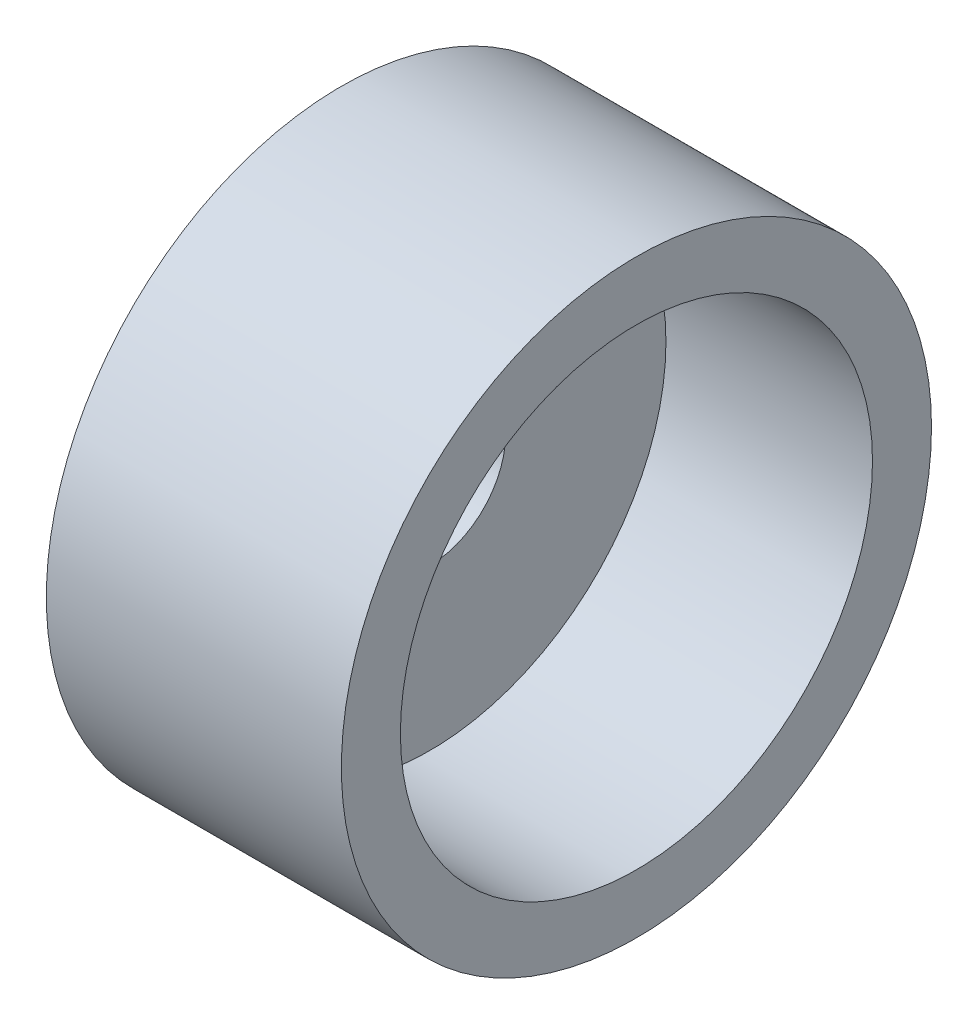
ISO-10303-21;
HEADER;
FILE_DESCRIPTION(('STEP AP214'),'2;1');
FILE_NAME('part.step','',(''),(''),'','','');
FILE_SCHEMA(('AUTOMOTIVE_DESIGN { 1 0 10303 214 1 1 1 1 }'));
ENDSEC;
DATA;
#1=APPLICATION_CONTEXT('core data for automotive mechanical design processes');
#2=APPLICATION_PROTOCOL_DEFINITION('international standard','automotive_design',2000,#1);
#3=PRODUCT_CONTEXT('',#1,'mechanical');
#4=PRODUCT('Part','Part','',(#3));
#5=PRODUCT_RELATED_PRODUCT_CATEGORY('part','',(#4));
#6=PRODUCT_DEFINITION_FORMATION('','',#4);
#7=PRODUCT_DEFINITION_CONTEXT('part definition',#1,'design');
#8=PRODUCT_DEFINITION('design','',#6,#7);
#9=PRODUCT_DEFINITION_SHAPE('','',#8);
#10=(LENGTH_UNIT() NAMED_UNIT(*) SI_UNIT(.MILLI.,.METRE.));
#11=(NAMED_UNIT(*) PLANE_ANGLE_UNIT() SI_UNIT($,.RADIAN.));
#12=(NAMED_UNIT(*) SI_UNIT($,.STERADIAN.) SOLID_ANGLE_UNIT());
#13=UNCERTAINTY_MEASURE_WITH_UNIT(LENGTH_MEASURE(1.E-05),#10,'distance_accuracy_value','');
#14=(GEOMETRIC_REPRESENTATION_CONTEXT(3) GLOBAL_UNCERTAINTY_ASSIGNED_CONTEXT((#13)) GLOBAL_UNIT_ASSIGNED_CONTEXT((#10,
#11,#12)) REPRESENTATION_CONTEXT('',''));
#15=CARTESIAN_POINT('',(0.,0.,0.));
#16=DIRECTION('',(0.,0.,1.));
#17=DIRECTION('',(1.,0.,0.));
#18=AXIS2_PLACEMENT_3D('',#15,#16,#17);
#19=CARTESIAN_POINT('',(50.,0.,0.));
#20=DIRECTION('',(-1.,0.,0.));
#21=DIRECTION('',(0.,0.,1.));
#22=AXIS2_PLACEMENT_3D('',#19,#20,#21);
#23=CYLINDRICAL_SURFACE('',#22,50.);
#24=CARTESIAN_POINT('',(50.,0.,0.));
#25=DIRECTION('',(1.,0.,0.));
#26=DIRECTION('',(0.,0.,-1.));
#27=AXIS2_PLACEMENT_3D('',#24,#25,#26);
#28=CIRCLE('',#27,50.);
#29=CARTESIAN_POINT('',(50.,0.,-50.));
#30=VERTEX_POINT('',#29);
#31=EDGE_CURVE('E14',#30,#30,#28,.T.);
#32=ORIENTED_EDGE('',*,*,#31,.F.);
#33=EDGE_LOOP('',(#32));
#34=FACE_BOUND('',#33,.T.);
#35=CARTESIAN_POINT('',(0.,0.,0.));
#36=DIRECTION('',(1.,0.,0.));
#37=DIRECTION('',(0.,0.,-1.));
#38=AXIS2_PLACEMENT_3D('',#35,#36,#37);
#39=CIRCLE('',#38,50.);
#40=CARTESIAN_POINT('',(0.,0.,-50.));
#41=VERTEX_POINT('',#40);
#42=EDGE_CURVE('E49',#41,#41,#39,.T.);
#43=ORIENTED_EDGE('',*,*,#42,.T.);
#44=EDGE_LOOP('',(#43));
#45=FACE_BOUND('',#44,.T.);
#46=ADVANCED_FACE('F46',(#34,#45),#23,.T.);
#47=CARTESIAN_POINT('',(50.,0.,0.));
#48=DIRECTION('',(1.,0.,0.));
#49=DIRECTION('',(0.,0.,-1.));
#50=AXIS2_PLACEMENT_3D('',#47,#48,#49);
#51=PLANE('',#50);
#52=CARTESIAN_POINT('',(50.,0.,0.));
#53=DIRECTION('',(1.,0.,0.));
#54=DIRECTION('',(0.,0.,-1.));
#55=AXIS2_PLACEMENT_3D('',#52,#53,#54);
#56=CIRCLE('',#55,40.);
#57=CARTESIAN_POINT('',(50.,0.,-40.));
#58=VERTEX_POINT('',#57);
#59=EDGE_CURVE('E148',#58,#58,#56,.T.);
#60=ORIENTED_EDGE('',*,*,#59,.F.);
#61=EDGE_LOOP('',(#60));
#62=FACE_BOUND('',#61,.T.);
#63=ORIENTED_EDGE('',*,*,#31,.T.);
#64=EDGE_LOOP('',(#63));
#65=FACE_BOUND('',#64,.T.);
#66=ADVANCED_FACE('F167',(#62,#65),#51,.T.);
#67=CARTESIAN_POINT('',(0.,0.,0.));
#68=DIRECTION('',(1.,0.,0.));
#69=DIRECTION('',(0.,0.,-1.));
#70=AXIS2_PLACEMENT_3D('',#67,#68,#69);
#71=PLANE('',#70);
#72=DIRECTION('',(0.,-0.866025403784439,0.5));
#73=VECTOR('',#72,1.);
#74=CARTESIAN_POINT('',(0.,-20.4597644868427,-11.812450534035));
#75=LINE('',#74,#73);
#76=CARTESIAN_POINT('',(0.,0.,-23.62490106807));
#77=VERTEX_POINT('',#76);
#78=CARTESIAN_POINT('',(0.,-20.4597644868427,-11.812450534035));
#79=VERTEX_POINT('',#78);
#80=EDGE_CURVE('E134',#77,#79,#75,.T.);
#81=ORIENTED_EDGE('',*,*,#80,.F.);
#82=DIRECTION('',(0.,-0.866025403784439,-0.5));
#83=VECTOR('',#82,1.);
#84=CARTESIAN_POINT('',(0.,0.,-23.62490106807));
#85=LINE('',#84,#83);
#86=CARTESIAN_POINT('',(0.,20.4597644868427,-11.812450534035));
#87=VERTEX_POINT('',#86);
#88=EDGE_CURVE('E60',#87,#77,#85,.T.);
#89=ORIENTED_EDGE('',*,*,#88,.F.);
#90=DIRECTION('',(0.,0.,-1.));
#91=VECTOR('',#90,1.);
#92=CARTESIAN_POINT('',(0.,20.4597644868427,-11.812450534035));
#93=LINE('',#92,#91);
#94=CARTESIAN_POINT('',(0.,20.4597644868427,11.812450534035));
#95=VERTEX_POINT('',#94);
#96=EDGE_CURVE('E144',#95,#87,#93,.T.);
#97=ORIENTED_EDGE('',*,*,#96,.F.);
#98=DIRECTION('',(0.,0.866025403784439,-0.5));
#99=VECTOR('',#98,1.);
#100=CARTESIAN_POINT('',(0.,20.4597644868427,11.812450534035));
#101=LINE('',#100,#99);
#102=CARTESIAN_POINT('',(0.,0.,23.62490106807));
#103=VERTEX_POINT('',#102);
#104=EDGE_CURVE('E142',#103,#95,#101,.T.);
#105=ORIENTED_EDGE('',*,*,#104,.F.);
#106=DIRECTION('',(0.,0.866025403784439,0.5));
#107=VECTOR('',#106,1.);
#108=CARTESIAN_POINT('',(0.,0.,23.62490106807));
#109=LINE('',#108,#107);
#110=CARTESIAN_POINT('',(0.,-20.4597644868427,11.812450534035));
#111=VERTEX_POINT('',#110);
#112=EDGE_CURVE('E108',#111,#103,#109,.T.);
#113=ORIENTED_EDGE('',*,*,#112,.F.);
#114=DIRECTION('',(0.,0.,1.));
#115=VECTOR('',#114,1.);
#116=CARTESIAN_POINT('',(0.,-20.4597644868427,11.812450534035));
#117=LINE('',#116,#115);
#118=EDGE_CURVE('E138',#79,#111,#117,.T.);
#119=ORIENTED_EDGE('',*,*,#118,.F.);
#120=EDGE_LOOP('',(#81,#89,#97,#105,#113,#119));
#121=FACE_BOUND('',#120,.T.);
#122=ORIENTED_EDGE('',*,*,#42,.F.);
#123=EDGE_LOOP('',(#122));
#124=FACE_BOUND('',#123,.T.);
#125=ADVANCED_FACE('F164',(#121,#124),#71,.F.);
#126=CARTESIAN_POINT('',(-113.137084989848,0.,0.));
#127=DIRECTION('',(1.,0.,0.));
#128=DIRECTION('',(0.,0.,-1.));
#129=AXIS2_PLACEMENT_3D('',#126,#127,#128);
#130=CYLINDRICAL_SURFACE('',#129,40.);
#131=CARTESIAN_POINT('',(15.,0.,0.));
#132=DIRECTION('',(1.,0.,0.));
#133=DIRECTION('',(0.,0.,-1.));
#134=AXIS2_PLACEMENT_3D('',#131,#132,#133);
#135=CIRCLE('',#134,40.);
#136=CARTESIAN_POINT('',(15.,0.,-40.));
#137=VERTEX_POINT('',#136);
#138=EDGE_CURVE('E156',#137,#137,#135,.F.);
#139=ORIENTED_EDGE('',*,*,#138,.T.);
#140=EDGE_LOOP('',(#139));
#141=FACE_BOUND('',#140,.T.);
#142=ORIENTED_EDGE('',*,*,#59,.T.);
#143=EDGE_LOOP('',(#142));
#144=FACE_BOUND('',#143,.T.);
#145=ADVANCED_FACE('F166',(#141,#144),#130,.F.);
#146=CARTESIAN_POINT('',(15.,0.,0.));
#147=DIRECTION('',(1.,0.,0.));
#148=DIRECTION('',(0.,0.,-1.));
#149=AXIS2_PLACEMENT_3D('',#146,#147,#148);
#150=PLANE('',#149);
#151=CARTESIAN_POINT('',(15.,0.,0.));
#152=DIRECTION('',(1.,0.,0.));
#153=DIRECTION('',(0.,0.,-1.));
#154=AXIS2_PLACEMENT_3D('',#151,#152,#153);
#155=CIRCLE('',#154,12.832707742248);
#156=CARTESIAN_POINT('',(15.,0.,-12.832707742248));
#157=VERTEX_POINT('',#156);
#158=EDGE_CURVE('E135',#157,#157,#155,.T.);
#159=ORIENTED_EDGE('',*,*,#158,.F.);
#160=EDGE_LOOP('',(#159));
#161=FACE_BOUND('',#160,.T.);
#162=ORIENTED_EDGE('',*,*,#138,.F.);
#163=EDGE_LOOP('',(#162));
#164=FACE_BOUND('',#163,.T.);
#165=ADVANCED_FACE('F173',(#161,#164),#150,.T.);
#166=CARTESIAN_POINT('',(10.,0.,-23.62490106807));
#167=DIRECTION('',(0.,0.5,-0.866025403784439));
#168=DIRECTION('',(0.,0.866025403784439,0.5));
#169=AXIS2_PLACEMENT_3D('',#166,#167,#168);
#170=PLANE('',#169);
#171=ORIENTED_EDGE('',*,*,#88,.T.);
#172=DIRECTION('',(-1.,0.,0.));
#173=VECTOR('',#172,1.);
#174=CARTESIAN_POINT('',(10.,0.,-23.62490106807));
#175=LINE('',#174,#173);
#176=CARTESIAN_POINT('',(10.,0.,-23.62490106807));
#177=VERTEX_POINT('',#176);
#178=EDGE_CURVE('E90',#177,#77,#175,.T.);
#179=ORIENTED_EDGE('',*,*,#178,.F.);
#180=DIRECTION('',(0.,-0.866025403784439,-0.5));
#181=VECTOR('',#180,1.);
#182=CARTESIAN_POINT('',(10.,0.,-23.62490106807));
#183=LINE('',#182,#181);
#184=CARTESIAN_POINT('',(10.,20.4597644868427,-11.812450534035));
#185=VERTEX_POINT('',#184);
#186=EDGE_CURVE('E146',#185,#177,#183,.T.);
#187=ORIENTED_EDGE('',*,*,#186,.F.);
#188=DIRECTION('',(-1.,0.,0.));
#189=VECTOR('',#188,1.);
#190=CARTESIAN_POINT('',(10.,20.4597644868427,-11.812450534035));
#191=LINE('',#190,#189);
#192=EDGE_CURVE('E68',#185,#87,#191,.T.);
#193=ORIENTED_EDGE('',*,*,#192,.T.);
#194=EDGE_LOOP('',(#171,#179,#187,#193));
#195=FACE_BOUND('',#194,.T.);
#196=ADVANCED_FACE('F205',(#195),#170,.F.);
#197=CARTESIAN_POINT('',(10.,20.4597644868427,-11.812450534035));
#198=DIRECTION('',(0.,1.,0.));
#199=DIRECTION('',(0.,0.,1.));
#200=AXIS2_PLACEMENT_3D('',#197,#198,#199);
#201=PLANE('',#200);
#202=ORIENTED_EDGE('',*,*,#96,.T.);
#203=ORIENTED_EDGE('',*,*,#192,.F.);
#204=DIRECTION('',(0.,0.,-1.));
#205=VECTOR('',#204,1.);
#206=CARTESIAN_POINT('',(10.,20.4597644868427,-11.812450534035));
#207=LINE('',#206,#205);
#208=CARTESIAN_POINT('',(10.,20.4597644868427,11.812450534035));
#209=VERTEX_POINT('',#208);
#210=EDGE_CURVE('E120',#209,#185,#207,.T.);
#211=ORIENTED_EDGE('',*,*,#210,.F.);
#212=DIRECTION('',(-1.,0.,0.));
#213=VECTOR('',#212,1.);
#214=CARTESIAN_POINT('',(10.,20.4597644868427,11.812450534035));
#215=LINE('',#214,#213);
#216=EDGE_CURVE('E112',#209,#95,#215,.T.);
#217=ORIENTED_EDGE('',*,*,#216,.T.);
#218=EDGE_LOOP('',(#202,#203,#211,#217));
#219=FACE_BOUND('',#218,.T.);
#220=ADVANCED_FACE('F210',(#219),#201,.F.);
#221=CARTESIAN_POINT('',(10.,20.4597644868427,11.812450534035));
#222=DIRECTION('',(0.,0.5,0.866025403784439));
#223=DIRECTION('',(0.,-0.866025403784439,0.5));
#224=AXIS2_PLACEMENT_3D('',#221,#222,#223);
#225=PLANE('',#224);
#226=ORIENTED_EDGE('',*,*,#104,.T.);
#227=ORIENTED_EDGE('',*,*,#216,.F.);
#228=DIRECTION('',(0.,0.866025403784439,-0.5));
#229=VECTOR('',#228,1.);
#230=CARTESIAN_POINT('',(10.,20.4597644868427,11.812450534035));
#231=LINE('',#230,#229);
#232=CARTESIAN_POINT('',(10.,0.,23.62490106807));
#233=VERTEX_POINT('',#232);
#234=EDGE_CURVE('E116',#233,#209,#231,.T.);
#235=ORIENTED_EDGE('',*,*,#234,.F.);
#236=DIRECTION('',(-1.,0.,0.));
#237=VECTOR('',#236,1.);
#238=CARTESIAN_POINT('',(10.,0.,23.62490106807));
#239=LINE('',#238,#237);
#240=EDGE_CURVE('E101',#233,#103,#239,.T.);
#241=ORIENTED_EDGE('',*,*,#240,.T.);
#242=EDGE_LOOP('',(#226,#227,#235,#241));
#243=FACE_BOUND('',#242,.T.);
#244=ADVANCED_FACE('F117',(#243),#225,.F.);
#245=CARTESIAN_POINT('',(10.,0.,23.62490106807));
#246=DIRECTION('',(0.,-0.5,0.866025403784439));
#247=DIRECTION('',(0.,-0.866025403784439,-0.5));
#248=AXIS2_PLACEMENT_3D('',#245,#246,#247);
#249=PLANE('',#248);
#250=ORIENTED_EDGE('',*,*,#112,.T.);
#251=ORIENTED_EDGE('',*,*,#240,.F.);
#252=DIRECTION('',(0.,0.866025403784439,0.5));
#253=VECTOR('',#252,1.);
#254=CARTESIAN_POINT('',(10.,0.,23.62490106807));
#255=LINE('',#254,#253);
#256=CARTESIAN_POINT('',(10.,-20.4597644868427,11.812450534035));
#257=VERTEX_POINT('',#256);
#258=EDGE_CURVE('E105',#257,#233,#255,.T.);
#259=ORIENTED_EDGE('',*,*,#258,.F.);
#260=DIRECTION('',(-1.,0.,0.));
#261=VECTOR('',#260,1.);
#262=CARTESIAN_POINT('',(10.,-20.4597644868427,11.812450534035));
#263=LINE('',#262,#261);
#264=EDGE_CURVE('E113',#257,#111,#263,.T.);
#265=ORIENTED_EDGE('',*,*,#264,.T.);
#266=EDGE_LOOP('',(#250,#251,#259,#265));
#267=FACE_BOUND('',#266,.T.);
#268=ADVANCED_FACE('F103',(#267),#249,.F.);
#269=CARTESIAN_POINT('',(10.,-20.4597644868427,11.812450534035));
#270=DIRECTION('',(0.,-1.,0.));
#271=DIRECTION('',(0.,0.,-1.));
#272=AXIS2_PLACEMENT_3D('',#269,#270,#271);
#273=PLANE('',#272);
#274=ORIENTED_EDGE('',*,*,#118,.T.);
#275=ORIENTED_EDGE('',*,*,#264,.F.);
#276=DIRECTION('',(0.,0.,1.));
#277=VECTOR('',#276,1.);
#278=CARTESIAN_POINT('',(10.,-20.4597644868427,11.812450534035));
#279=LINE('',#278,#277);
#280=CARTESIAN_POINT('',(10.,-20.4597644868427,-11.812450534035));
#281=VERTEX_POINT('',#280);
#282=EDGE_CURVE('E126',#281,#257,#279,.T.);
#283=ORIENTED_EDGE('',*,*,#282,.F.);
#284=DIRECTION('',(-1.,0.,0.));
#285=VECTOR('',#284,1.);
#286=CARTESIAN_POINT('',(10.,-20.4597644868427,-11.812450534035));
#287=LINE('',#286,#285);
#288=EDGE_CURVE('E151',#281,#79,#287,.T.);
#289=ORIENTED_EDGE('',*,*,#288,.T.);
#290=EDGE_LOOP('',(#274,#275,#283,#289));
#291=FACE_BOUND('',#290,.T.);
#292=ADVANCED_FACE('F235',(#291),#273,.F.);
#293=CARTESIAN_POINT('',(10.,-20.4597644868427,-11.812450534035));
#294=DIRECTION('',(0.,-0.5,-0.866025403784439));
#295=DIRECTION('',(0.,0.866025403784439,-0.5));
#296=AXIS2_PLACEMENT_3D('',#293,#294,#295);
#297=PLANE('',#296);
#298=ORIENTED_EDGE('',*,*,#80,.T.);
#299=ORIENTED_EDGE('',*,*,#288,.F.);
#300=DIRECTION('',(0.,-0.866025403784439,0.5));
#301=VECTOR('',#300,1.);
#302=CARTESIAN_POINT('',(10.,-20.4597644868427,-11.812450534035));
#303=LINE('',#302,#301);
#304=EDGE_CURVE('E128',#177,#281,#303,.T.);
#305=ORIENTED_EDGE('',*,*,#304,.F.);
#306=ORIENTED_EDGE('',*,*,#178,.T.);
#307=EDGE_LOOP('',(#298,#299,#305,#306));
#308=FACE_BOUND('',#307,.T.);
#309=ADVANCED_FACE('F244',(#308),#297,.F.);
#310=CARTESIAN_POINT('',(10.,0.,0.));
#311=DIRECTION('',(1.,0.,0.));
#312=DIRECTION('',(0.,0.,-1.));
#313=AXIS2_PLACEMENT_3D('',#310,#311,#312);
#314=PLANE('',#313);
#315=CARTESIAN_POINT('',(10.,0.,0.));
#316=DIRECTION('',(-1.,0.,0.));
#317=DIRECTION('',(0.,0.,1.));
#318=AXIS2_PLACEMENT_3D('',#315,#316,#317);
#319=CIRCLE('',#318,12.832707742248);
#320=CARTESIAN_POINT('',(10.,0.,12.832707742248));
#321=VERTEX_POINT('',#320);
#322=EDGE_CURVE('E289',#321,#321,#319,.T.);
#323=ORIENTED_EDGE('',*,*,#322,.F.);
#324=EDGE_LOOP('',(#323));
#325=FACE_BOUND('',#324,.T.);
#326=ORIENTED_EDGE('',*,*,#186,.T.);
#327=ORIENTED_EDGE('',*,*,#304,.T.);
#328=ORIENTED_EDGE('',*,*,#282,.T.);
#329=ORIENTED_EDGE('',*,*,#258,.T.);
#330=ORIENTED_EDGE('',*,*,#234,.T.);
#331=ORIENTED_EDGE('',*,*,#210,.T.);
#332=EDGE_LOOP('',(#326,#327,#328,#329,#330,#331));
#333=FACE_BOUND('',#332,.T.);
#334=ADVANCED_FACE('F123',(#325,#333),#314,.F.);
#335=CARTESIAN_POINT('',(50.,0.,0.));
#336=DIRECTION('',(-1.,0.,0.));
#337=DIRECTION('',(0.,0.,1.));
#338=AXIS2_PLACEMENT_3D('',#335,#336,#337);
#339=CYLINDRICAL_SURFACE('',#338,12.832707742248);
#340=ORIENTED_EDGE('',*,*,#158,.T.);
#341=EDGE_LOOP('',(#340));
#342=FACE_BOUND('',#341,.T.);
#343=ORIENTED_EDGE('',*,*,#322,.T.);
#344=EDGE_LOOP('',(#343));
#345=FACE_BOUND('',#344,.T.);
#346=ADVANCED_FACE('F270',(#342,#345),#339,.F.);
#347=CLOSED_SHELL('',(#46,#66,#125,#145,#165,#196,#220,#244,#268,#292,#309,#334,#346));
#348=MANIFOLD_SOLID_BREP('B2',#347);
#349=ADVANCED_BREP_SHAPE_REPRESENTATION('',(#18,#348),#14);
#350=SHAPE_DEFINITION_REPRESENTATION(#9,#349);
ENDSEC;
END-ISO-10303-21;
